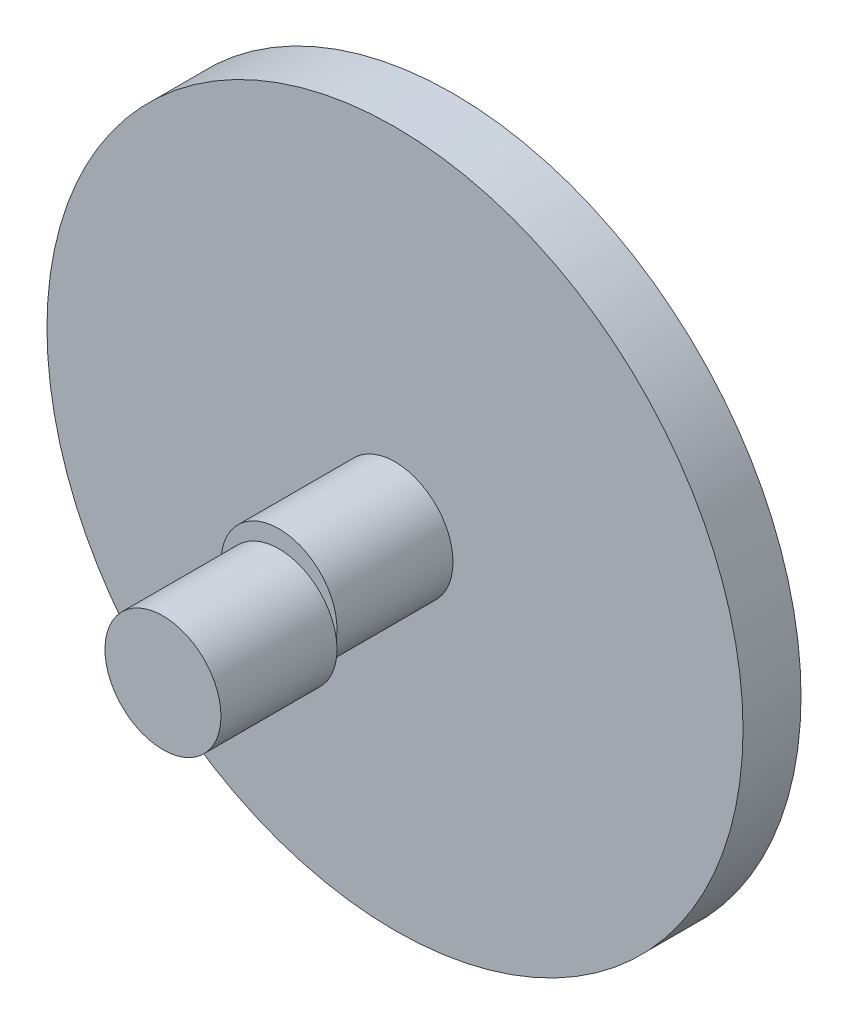
ISO-10303-21;
HEADER;
FILE_DESCRIPTION(('STEP AP214'),'2;1');
FILE_NAME('part.step','',(''),(''),'','','');
FILE_SCHEMA(('AUTOMOTIVE_DESIGN { 1 0 10303 214 1 1 1 1 }'));
ENDSEC;
DATA;
#1=APPLICATION_CONTEXT('core data for automotive mechanical design processes');
#2=APPLICATION_PROTOCOL_DEFINITION('international standard','automotive_design',2000,#1);
#3=PRODUCT_CONTEXT('',#1,'mechanical');
#4=PRODUCT('Part','Part','',(#3));
#5=PRODUCT_RELATED_PRODUCT_CATEGORY('part','',(#4));
#6=PRODUCT_DEFINITION_FORMATION('','',#4);
#7=PRODUCT_DEFINITION_CONTEXT('part definition',#1,'design');
#8=PRODUCT_DEFINITION('design','',#6,#7);
#9=PRODUCT_DEFINITION_SHAPE('','',#8);
#10=(LENGTH_UNIT() NAMED_UNIT(*) SI_UNIT(.MILLI.,.METRE.));
#11=(NAMED_UNIT(*) PLANE_ANGLE_UNIT() SI_UNIT($,.RADIAN.));
#12=(NAMED_UNIT(*) SI_UNIT($,.STERADIAN.) SOLID_ANGLE_UNIT());
#13=UNCERTAINTY_MEASURE_WITH_UNIT(LENGTH_MEASURE(1.E-05),#10,'distance_accuracy_value','');
#14=(GEOMETRIC_REPRESENTATION_CONTEXT(3) GLOBAL_UNCERTAINTY_ASSIGNED_CONTEXT((#13)) GLOBAL_UNIT_ASSIGNED_CONTEXT((#10,
#11,#12)) REPRESENTATION_CONTEXT('',''));
#15=CARTESIAN_POINT('',(0.,0.,0.));
#16=DIRECTION('',(0.,0.,1.));
#17=DIRECTION('',(1.,0.,0.));
#18=AXIS2_PLACEMENT_3D('',#15,#16,#17);
#19=CARTESIAN_POINT('',(0.,0.,6.35));
#20=DIRECTION('',(0.,0.,-1.));
#21=DIRECTION('',(-1.,0.,0.));
#22=AXIS2_PLACEMENT_3D('',#19,#20,#21);
#23=CYLINDRICAL_SURFACE('',#22,38.1);
#24=CARTESIAN_POINT('',(0.,0.,6.35));
#25=DIRECTION('',(0.,0.,1.));
#26=DIRECTION('',(1.,0.,0.));
#27=AXIS2_PLACEMENT_3D('',#24,#25,#26);
#28=CIRCLE('',#27,38.1);
#29=CARTESIAN_POINT('',(38.1,0.,6.35));
#30=VERTEX_POINT('',#29);
#31=EDGE_CURVE('E54',#30,#30,#28,.T.);
#32=ORIENTED_EDGE('',*,*,#31,.F.);
#33=EDGE_LOOP('',(#32));
#34=FACE_BOUND('',#33,.T.);
#35=CARTESIAN_POINT('',(0.,0.,0.));
#36=DIRECTION('',(0.,0.,1.));
#37=DIRECTION('',(1.,0.,0.));
#38=AXIS2_PLACEMENT_3D('',#35,#36,#37);
#39=CIRCLE('',#38,38.1);
#40=CARTESIAN_POINT('',(38.1,0.,0.));
#41=VERTEX_POINT('',#40);
#42=EDGE_CURVE('E48',#41,#41,#39,.T.);
#43=ORIENTED_EDGE('',*,*,#42,.T.);
#44=EDGE_LOOP('',(#43));
#45=FACE_BOUND('',#44,.T.);
#46=ADVANCED_FACE('F45',(#34,#45),#23,.T.);
#47=CARTESIAN_POINT('',(0.,0.,6.35));
#48=DIRECTION('',(0.,0.,1.));
#49=DIRECTION('',(1.,0.,0.));
#50=AXIS2_PLACEMENT_3D('',#47,#48,#49);
#51=PLANE('',#50);
#52=CARTESIAN_POINT('',(0.,0.,6.35));
#53=DIRECTION('',(0.,0.,1.));
#54=DIRECTION('',(1.,0.,0.));
#55=AXIS2_PLACEMENT_3D('',#52,#53,#54);
#56=CIRCLE('',#55,6.35);
#57=CARTESIAN_POINT('',(6.35,0.,6.35));
#58=VERTEX_POINT('',#57);
#59=EDGE_CURVE('E11',#58,#58,#56,.T.);
#60=ORIENTED_EDGE('',*,*,#59,.F.);
#61=EDGE_LOOP('',(#60));
#62=FACE_BOUND('',#61,.T.);
#63=ORIENTED_EDGE('',*,*,#31,.T.);
#64=EDGE_LOOP('',(#63));
#65=FACE_BOUND('',#64,.T.);
#66=ADVANCED_FACE('F101',(#62,#65),#51,.T.);
#67=CARTESIAN_POINT('',(0.,0.,0.));
#68=DIRECTION('',(0.,0.,1.));
#69=DIRECTION('',(1.,0.,0.));
#70=AXIS2_PLACEMENT_3D('',#67,#68,#69);
#71=PLANE('',#70);
#72=CARTESIAN_POINT('',(25.4,0.,0.));
#73=DIRECTION('',(0.,0.,-1.));
#74=DIRECTION('',(-1.,0.,0.));
#75=AXIS2_PLACEMENT_3D('',#72,#73,#74);
#76=CIRCLE('',#75,3.175);
#77=CARTESIAN_POINT('',(22.225,0.,0.));
#78=VERTEX_POINT('',#77);
#79=EDGE_CURVE('E374',#78,#78,#76,.T.);
#80=ORIENTED_EDGE('',*,*,#79,.F.);
#81=EDGE_LOOP('',(#80));
#82=FACE_BOUND('',#81,.T.);
#83=CARTESIAN_POINT('',(12.7000000000003,-21.9970452561246,0.));
#84=DIRECTION('',(0.,0.,-1.));
#85=DIRECTION('',(-1.,0.,0.));
#86=AXIS2_PLACEMENT_3D('',#83,#84,#85);
#87=CIRCLE('',#86,3.175);
#88=CARTESIAN_POINT('',(9.52500000000026,-21.9970452561246,0.));
#89=VERTEX_POINT('',#88);
#90=EDGE_CURVE('E381',#89,#89,#87,.T.);
#91=ORIENTED_EDGE('',*,*,#90,.F.);
#92=EDGE_LOOP('',(#91));
#93=FACE_BOUND('',#92,.T.);
#94=CARTESIAN_POINT('',(-12.6999999999998,-21.9970452561249,0.));
#95=DIRECTION('',(0.,0.,-1.));
#96=DIRECTION('',(-1.,0.,0.));
#97=AXIS2_PLACEMENT_3D('',#94,#95,#96);
#98=CIRCLE('',#97,3.175);
#99=CARTESIAN_POINT('',(-15.8749999999998,-21.9970452561249,0.));
#100=VERTEX_POINT('',#99);
#101=EDGE_CURVE('E413',#100,#100,#98,.T.);
#102=ORIENTED_EDGE('',*,*,#101,.F.);
#103=EDGE_LOOP('',(#102));
#104=FACE_BOUND('',#103,.T.);
#105=CARTESIAN_POINT('',(-25.4,-1.77367252013231E-13,0.));
#106=DIRECTION('',(0.,0.,-1.));
#107=DIRECTION('',(-1.,0.,0.));
#108=AXIS2_PLACEMENT_3D('',#105,#106,#107);
#109=CIRCLE('',#108,3.175);
#110=CARTESIAN_POINT('',(-28.575,-1.77367252013231E-13,0.));
#111=VERTEX_POINT('',#110);
#112=EDGE_CURVE('E405',#111,#111,#109,.T.);
#113=ORIENTED_EDGE('',*,*,#112,.F.);
#114=EDGE_LOOP('',(#113));
#115=FACE_BOUND('',#114,.T.);
#116=CARTESIAN_POINT('',(-12.7000000000001,21.9970452561247,0.));
#117=DIRECTION('',(0.,0.,-1.));
#118=DIRECTION('',(-1.,0.,0.));
#119=AXIS2_PLACEMENT_3D('',#116,#117,#118);
#120=CIRCLE('',#119,3.17500000000001);
#121=CARTESIAN_POINT('',(-15.8750000000001,21.9970452561247,0.));
#122=VERTEX_POINT('',#121);
#123=EDGE_CURVE('E397',#122,#122,#120,.T.);
#124=ORIENTED_EDGE('',*,*,#123,.F.);
#125=EDGE_LOOP('',(#124));
#126=FACE_BOUND('',#125,.T.);
#127=CARTESIAN_POINT('',(12.6999999999999,21.9970452561248,0.));
#128=DIRECTION('',(0.,0.,-1.));
#129=DIRECTION('',(-1.,0.,0.));
#130=AXIS2_PLACEMENT_3D('',#127,#128,#129);
#131=CIRCLE('',#130,3.175);
#132=CARTESIAN_POINT('',(9.52499999999995,21.9970452561248,0.));
#133=VERTEX_POINT('',#132);
#134=EDGE_CURVE('E378',#133,#133,#131,.T.);
#135=ORIENTED_EDGE('',*,*,#134,.F.);
#136=EDGE_LOOP('',(#135));
#137=FACE_BOUND('',#136,.T.);
#138=ORIENTED_EDGE('',*,*,#42,.F.);
#139=EDGE_LOOP('',(#138));
#140=FACE_BOUND('',#139,.T.);
#141=ADVANCED_FACE('F99',(#82,#93,#104,#115,#126,#137,#140),#71,.F.);
#142=CARTESIAN_POINT('',(0.,0.,19.05));
#143=DIRECTION('',(0.,0.,-1.));
#144=DIRECTION('',(-1.,0.,0.));
#145=AXIS2_PLACEMENT_3D('',#142,#143,#144);
#146=CYLINDRICAL_SURFACE('',#145,6.35);
#147=CARTESIAN_POINT('',(0.,0.,19.05));
#148=DIRECTION('',(0.,0.,1.));
#149=DIRECTION('',(1.,0.,0.));
#150=AXIS2_PLACEMENT_3D('',#147,#148,#149);
#151=CIRCLE('',#150,6.35);
#152=CARTESIAN_POINT('',(-6.27815607881805,-0.9525,19.05));
#153=VERTEX_POINT('',#152);
#154=CARTESIAN_POINT('',(6.27815607881805,-0.9525,19.05));
#155=VERTEX_POINT('',#154);
#156=EDGE_CURVE('E66',#153,#155,#151,.T.);
#157=ORIENTED_EDGE('',*,*,#156,.F.);
#158=EDGE_CURVE('E69',#155,#153,#151,.T.);
#159=ORIENTED_EDGE('',*,*,#158,.F.);
#160=EDGE_LOOP('',(#157,#159));
#161=FACE_BOUND('',#160,.T.);
#162=ORIENTED_EDGE('',*,*,#59,.T.);
#163=EDGE_LOOP('',(#162));
#164=FACE_BOUND('',#163,.T.);
#165=ADVANCED_FACE('F67',(#161,#164),#146,.T.);
#166=CARTESIAN_POINT('',(0.,0.,19.05));
#167=DIRECTION('',(0.,0.,1.));
#168=DIRECTION('',(1.,0.,0.));
#169=AXIS2_PLACEMENT_3D('',#166,#167,#168);
#170=PLANE('',#169);
#171=CARTESIAN_POINT('',(0.,-1.905,19.05));
#172=DIRECTION('',(0.,0.,1.));
#173=DIRECTION('',(1.,0.,0.));
#174=AXIS2_PLACEMENT_3D('',#171,#172,#173);
#175=CIRCLE('',#174,6.35);
#176=EDGE_CURVE('E61',#155,#153,#175,.T.);
#177=ORIENTED_EDGE('',*,*,#176,.F.);
#178=ORIENTED_EDGE('',*,*,#158,.T.);
#179=EDGE_LOOP('',(#177,#178));
#180=FACE_BOUND('',#179,.T.);
#181=ADVANCED_FACE('F75',(#180),#170,.T.);
#182=CARTESIAN_POINT('',(0.,-1.905,19.05));
#183=DIRECTION('',(0.,0.,1.));
#184=DIRECTION('',(1.,0.,0.));
#185=AXIS2_PLACEMENT_3D('',#182,#183,#184);
#186=PLANE('',#185);
#187=EDGE_CURVE('E78',#153,#155,#175,.T.);
#188=ORIENTED_EDGE('',*,*,#187,.F.);
#189=ORIENTED_EDGE('',*,*,#156,.T.);
#190=EDGE_LOOP('',(#188,#189));
#191=FACE_BOUND('',#190,.T.);
#192=ADVANCED_FACE('F79',(#191),#186,.F.);
#193=CARTESIAN_POINT('',(0.,-1.905,31.75));
#194=DIRECTION('',(0.,0.,-1.));
#195=DIRECTION('',(-1.,0.,0.));
#196=AXIS2_PLACEMENT_3D('',#193,#194,#195);
#197=CYLINDRICAL_SURFACE('',#196,6.35);
#198=CARTESIAN_POINT('',(0.,-1.905,31.75));
#199=DIRECTION('',(0.,0.,1.));
#200=DIRECTION('',(1.,0.,0.));
#201=AXIS2_PLACEMENT_3D('',#198,#199,#200);
#202=CIRCLE('',#201,6.35);
#203=CARTESIAN_POINT('',(6.35,-1.905,31.75));
#204=VERTEX_POINT('',#203);
#205=EDGE_CURVE('E77',#204,#204,#202,.T.);
#206=ORIENTED_EDGE('',*,*,#205,.F.);
#207=EDGE_LOOP('',(#206));
#208=FACE_BOUND('',#207,.T.);
#209=ORIENTED_EDGE('',*,*,#176,.T.);
#210=ORIENTED_EDGE('',*,*,#187,.T.);
#211=EDGE_LOOP('',(#209,#210));
#212=FACE_BOUND('',#211,.T.);
#213=ADVANCED_FACE('F84',(#208,#212),#197,.T.);
#214=CARTESIAN_POINT('',(0.,-1.905,31.75));
#215=DIRECTION('',(0.,0.,1.));
#216=DIRECTION('',(1.,0.,0.));
#217=AXIS2_PLACEMENT_3D('',#214,#215,#216);
#218=PLANE('',#217);
#219=ORIENTED_EDGE('',*,*,#205,.T.);
#220=EDGE_LOOP('',(#219));
#221=FACE_BOUND('',#220,.T.);
#222=ADVANCED_FACE('F157',(#221),#218,.T.);
#223=CARTESIAN_POINT('',(12.6999999999999,21.9970452561248,3.175));
#224=DIRECTION('',(0.,0.,-1.));
#225=DIRECTION('',(-1.,0.,0.));
#226=AXIS2_PLACEMENT_3D('',#223,#224,#225);
#227=CYLINDRICAL_SURFACE('',#226,3.175);
#228=CARTESIAN_POINT('',(12.6999999999999,21.9970452561248,3.175));
#229=DIRECTION('',(0.,0.,-1.));
#230=DIRECTION('',(-1.,0.,0.));
#231=AXIS2_PLACEMENT_3D('',#228,#229,#230);
#232=CIRCLE('',#231,3.175);
#233=CARTESIAN_POINT('',(9.52499999999995,21.9970452561248,3.175));
#234=VERTEX_POINT('',#233);
#235=EDGE_CURVE('E393',#234,#234,#232,.T.);
#236=ORIENTED_EDGE('',*,*,#235,.F.);
#237=EDGE_LOOP('',(#236));
#238=FACE_BOUND('',#237,.T.);
#239=ORIENTED_EDGE('',*,*,#134,.T.);
#240=EDGE_LOOP('',(#239));
#241=FACE_BOUND('',#240,.T.);
#242=ADVANCED_FACE('F166',(#238,#241),#227,.F.);
#243=CARTESIAN_POINT('',(12.6999999999999,21.9970452561248,3.175));
#244=DIRECTION('',(0.,0.,-1.));
#245=DIRECTION('',(-1.,0.,0.));
#246=AXIS2_PLACEMENT_3D('',#243,#244,#245);
#247=PLANE('',#246);
#248=ORIENTED_EDGE('',*,*,#235,.T.);
#249=EDGE_LOOP('',(#248));
#250=FACE_BOUND('',#249,.T.);
#251=ADVANCED_FACE('F175',(#250),#247,.T.);
#252=CARTESIAN_POINT('',(-12.7000000000001,21.9970452561247,3.175));
#253=DIRECTION('',(0.,0.,-1.));
#254=DIRECTION('',(-1.,0.,0.));
#255=AXIS2_PLACEMENT_3D('',#252,#253,#254);
#256=CYLINDRICAL_SURFACE('',#255,3.17500000000001);
#257=CARTESIAN_POINT('',(-12.7000000000001,21.9970452561247,3.175));
#258=DIRECTION('',(0.,0.,-1.));
#259=DIRECTION('',(-1.,0.,0.));
#260=AXIS2_PLACEMENT_3D('',#257,#258,#259);
#261=CIRCLE('',#260,3.17500000000001);
#262=CARTESIAN_POINT('',(-15.8750000000001,21.9970452561247,3.175));
#263=VERTEX_POINT('',#262);
#264=EDGE_CURVE('E401',#263,#263,#261,.T.);
#265=ORIENTED_EDGE('',*,*,#264,.F.);
#266=EDGE_LOOP('',(#265));
#267=FACE_BOUND('',#266,.T.);
#268=ORIENTED_EDGE('',*,*,#123,.T.);
#269=EDGE_LOOP('',(#268));
#270=FACE_BOUND('',#269,.T.);
#271=ADVANCED_FACE('F185',(#267,#270),#256,.F.);
#272=CARTESIAN_POINT('',(-12.7000000000001,21.9970452561247,3.175));
#273=DIRECTION('',(0.,0.,-1.));
#274=DIRECTION('',(-1.,0.,0.));
#275=AXIS2_PLACEMENT_3D('',#272,#273,#274);
#276=PLANE('',#275);
#277=ORIENTED_EDGE('',*,*,#264,.T.);
#278=EDGE_LOOP('',(#277));
#279=FACE_BOUND('',#278,.T.);
#280=ADVANCED_FACE('F195',(#279),#276,.T.);
#281=CARTESIAN_POINT('',(-25.4,-1.77367252013231E-13,3.175));
#282=DIRECTION('',(0.,0.,-1.));
#283=DIRECTION('',(-1.,0.,0.));
#284=AXIS2_PLACEMENT_3D('',#281,#282,#283);
#285=CYLINDRICAL_SURFACE('',#284,3.175);
#286=CARTESIAN_POINT('',(-25.4,-1.77367252013231E-13,3.175));
#287=DIRECTION('',(0.,0.,-1.));
#288=DIRECTION('',(-1.,0.,0.));
#289=AXIS2_PLACEMENT_3D('',#286,#287,#288);
#290=CIRCLE('',#289,3.175);
#291=CARTESIAN_POINT('',(-28.575,-1.77367252013231E-13,3.175));
#292=VERTEX_POINT('',#291);
#293=EDGE_CURVE('E409',#292,#292,#290,.T.);
#294=ORIENTED_EDGE('',*,*,#293,.F.);
#295=EDGE_LOOP('',(#294));
#296=FACE_BOUND('',#295,.T.);
#297=ORIENTED_EDGE('',*,*,#112,.T.);
#298=EDGE_LOOP('',(#297));
#299=FACE_BOUND('',#298,.T.);
#300=ADVANCED_FACE('F205',(#296,#299),#285,.F.);
#301=CARTESIAN_POINT('',(-25.4,-1.77367252013231E-13,3.175));
#302=DIRECTION('',(0.,0.,-1.));
#303=DIRECTION('',(-1.,0.,0.));
#304=AXIS2_PLACEMENT_3D('',#301,#302,#303);
#305=PLANE('',#304);
#306=ORIENTED_EDGE('',*,*,#293,.T.);
#307=EDGE_LOOP('',(#306));
#308=FACE_BOUND('',#307,.T.);
#309=ADVANCED_FACE('F215',(#308),#305,.T.);
#310=CARTESIAN_POINT('',(-12.6999999999998,-21.9970452561249,3.175));
#311=DIRECTION('',(0.,0.,-1.));
#312=DIRECTION('',(-1.,0.,0.));
#313=AXIS2_PLACEMENT_3D('',#310,#311,#312);
#314=CYLINDRICAL_SURFACE('',#313,3.175);
#315=CARTESIAN_POINT('',(-12.6999999999998,-21.9970452561249,3.175));
#316=DIRECTION('',(0.,0.,-1.));
#317=DIRECTION('',(-1.,0.,0.));
#318=AXIS2_PLACEMENT_3D('',#315,#316,#317);
#319=CIRCLE('',#318,3.175);
#320=CARTESIAN_POINT('',(-15.8749999999998,-21.9970452561249,3.175));
#321=VERTEX_POINT('',#320);
#322=EDGE_CURVE('E385',#321,#321,#319,.T.);
#323=ORIENTED_EDGE('',*,*,#322,.F.);
#324=EDGE_LOOP('',(#323));
#325=FACE_BOUND('',#324,.T.);
#326=ORIENTED_EDGE('',*,*,#101,.T.);
#327=EDGE_LOOP('',(#326));
#328=FACE_BOUND('',#327,.T.);
#329=ADVANCED_FACE('F225',(#325,#328),#314,.F.);
#330=CARTESIAN_POINT('',(-12.6999999999998,-21.9970452561249,3.175));
#331=DIRECTION('',(0.,0.,-1.));
#332=DIRECTION('',(-1.,0.,0.));
#333=AXIS2_PLACEMENT_3D('',#330,#331,#332);
#334=PLANE('',#333);
#335=ORIENTED_EDGE('',*,*,#322,.T.);
#336=EDGE_LOOP('',(#335));
#337=FACE_BOUND('',#336,.T.);
#338=ADVANCED_FACE('F235',(#337),#334,.T.);
#339=CARTESIAN_POINT('',(12.7000000000003,-21.9970452561246,3.175));
#340=DIRECTION('',(0.,0.,-1.));
#341=DIRECTION('',(-1.,0.,0.));
#342=AXIS2_PLACEMENT_3D('',#339,#340,#341);
#343=CYLINDRICAL_SURFACE('',#342,3.175);
#344=CARTESIAN_POINT('',(12.7000000000003,-21.9970452561246,3.175));
#345=DIRECTION('',(0.,0.,-1.));
#346=DIRECTION('',(-1.,0.,0.));
#347=AXIS2_PLACEMENT_3D('',#344,#345,#346);
#348=CIRCLE('',#347,3.175);
#349=CARTESIAN_POINT('',(9.52500000000026,-21.9970452561246,3.175));
#350=VERTEX_POINT('',#349);
#351=EDGE_CURVE('E386',#350,#350,#348,.T.);
#352=ORIENTED_EDGE('',*,*,#351,.F.);
#353=EDGE_LOOP('',(#352));
#354=FACE_BOUND('',#353,.T.);
#355=ORIENTED_EDGE('',*,*,#90,.T.);
#356=EDGE_LOOP('',(#355));
#357=FACE_BOUND('',#356,.T.);
#358=ADVANCED_FACE('F245',(#354,#357),#343,.F.);
#359=CARTESIAN_POINT('',(12.7000000000003,-21.9970452561246,3.175));
#360=DIRECTION('',(0.,0.,-1.));
#361=DIRECTION('',(-1.,0.,0.));
#362=AXIS2_PLACEMENT_3D('',#359,#360,#361);
#363=PLANE('',#362);
#364=ORIENTED_EDGE('',*,*,#351,.T.);
#365=EDGE_LOOP('',(#364));
#366=FACE_BOUND('',#365,.T.);
#367=ADVANCED_FACE('F255',(#366),#363,.T.);
#368=CARTESIAN_POINT('',(25.4,0.,3.175));
#369=DIRECTION('',(0.,0.,-1.));
#370=DIRECTION('',(-1.,0.,0.));
#371=AXIS2_PLACEMENT_3D('',#368,#369,#370);
#372=CYLINDRICAL_SURFACE('',#371,3.175);
#373=CARTESIAN_POINT('',(25.4,0.,3.175));
#374=DIRECTION('',(0.,0.,-1.));
#375=DIRECTION('',(-1.,0.,0.));
#376=AXIS2_PLACEMENT_3D('',#373,#374,#375);
#377=CIRCLE('',#376,3.175);
#378=CARTESIAN_POINT('',(22.225,0.,3.175));
#379=VERTEX_POINT('',#378);
#380=EDGE_CURVE('E82',#379,#379,#377,.T.);
#381=ORIENTED_EDGE('',*,*,#380,.F.);
#382=EDGE_LOOP('',(#381));
#383=FACE_BOUND('',#382,.T.);
#384=ORIENTED_EDGE('',*,*,#79,.T.);
#385=EDGE_LOOP('',(#384));
#386=FACE_BOUND('',#385,.T.);
#387=ADVANCED_FACE('F265',(#383,#386),#372,.F.);
#388=CARTESIAN_POINT('',(25.4,0.,3.175));
#389=DIRECTION('',(0.,0.,-1.));
#390=DIRECTION('',(-1.,0.,0.));
#391=AXIS2_PLACEMENT_3D('',#388,#389,#390);
#392=PLANE('',#391);
#393=ORIENTED_EDGE('',*,*,#380,.T.);
#394=EDGE_LOOP('',(#393));
#395=FACE_BOUND('',#394,.T.);
#396=ADVANCED_FACE('F275',(#395),#392,.T.);
#397=CLOSED_SHELL('',(#46,#66,#141,#165,#181,#192,#213,#222,#242,#251,#271,#280,#300,#309,#329,
#338,#358,#367,#387,#396));
#398=MANIFOLD_SOLID_BREP('B2',#397);
#399=ADVANCED_BREP_SHAPE_REPRESENTATION('',(#18,#398),#14);
#400=SHAPE_DEFINITION_REPRESENTATION(#9,#399);
ENDSEC;
END-ISO-10303-21;
